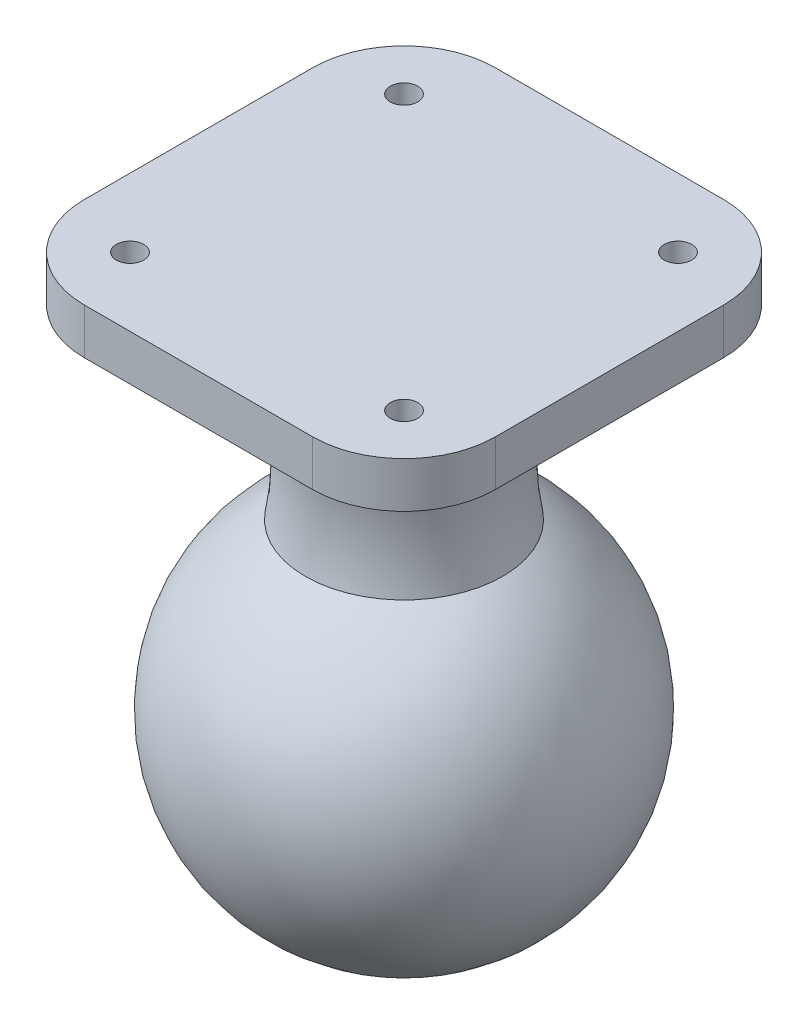
ISO-10303-21;
HEADER;
FILE_DESCRIPTION(('STEP AP214'),'2;1');
FILE_NAME('part.step','',(''),(''),'','','');
FILE_SCHEMA(('AUTOMOTIVE_DESIGN { 1 0 10303 214 1 1 1 1 }'));
ENDSEC;
DATA;
#1=APPLICATION_CONTEXT('core data for automotive mechanical design processes');
#2=APPLICATION_PROTOCOL_DEFINITION('international standard','automotive_design',2000,#1);
#3=PRODUCT_CONTEXT('',#1,'mechanical');
#4=PRODUCT('Part','Part','',(#3));
#5=PRODUCT_RELATED_PRODUCT_CATEGORY('part','',(#4));
#6=PRODUCT_DEFINITION_FORMATION('','',#4);
#7=PRODUCT_DEFINITION_CONTEXT('part definition',#1,'design');
#8=PRODUCT_DEFINITION('design','',#6,#7);
#9=PRODUCT_DEFINITION_SHAPE('','',#8);
#10=(LENGTH_UNIT() NAMED_UNIT(*) SI_UNIT(.MILLI.,.METRE.));
#11=(NAMED_UNIT(*) PLANE_ANGLE_UNIT() SI_UNIT($,.RADIAN.));
#12=(NAMED_UNIT(*) SI_UNIT($,.STERADIAN.) SOLID_ANGLE_UNIT());
#13=UNCERTAINTY_MEASURE_WITH_UNIT(LENGTH_MEASURE(1.E-05),#10,'distance_accuracy_value','');
#14=(GEOMETRIC_REPRESENTATION_CONTEXT(3) GLOBAL_UNCERTAINTY_ASSIGNED_CONTEXT((#13)) GLOBAL_UNIT_ASSIGNED_CONTEXT((#10,
#11,#12)) REPRESENTATION_CONTEXT('',''));
#15=CARTESIAN_POINT('',(0.,0.,0.));
#16=DIRECTION('',(0.,0.,1.));
#17=DIRECTION('',(1.,0.,0.));
#18=AXIS2_PLACEMENT_3D('',#15,#16,#17);
#19=CARTESIAN_POINT('',(0.,-15.,0.));
#20=DIRECTION('',(0.,1.,0.));
#21=DIRECTION('',(0.,0.,1.));
#22=AXIS2_PLACEMENT_3D('',#19,#20,#21);
#23=TOROIDAL_SURFACE('',#22,39.3102194007113,29.);
#24=CARTESIAN_POINT('',(0.,0.,0.));
#25=DIRECTION('',(0.,1.,0.));
#26=DIRECTION('',(0.,0.,1.));
#27=AXIS2_PLACEMENT_3D('',#24,#25,#26);
#28=CIRCLE('',#27,14.4908721087296);
#29=CARTESIAN_POINT('',(0.,0.,14.4908721087296));
#30=VERTEX_POINT('',#29);
#31=EDGE_CURVE('E206',#30,#30,#28,.T.);
#32=ORIENTED_EDGE('',*,*,#31,.F.);
#33=EDGE_LOOP('',(#32));
#34=FACE_BOUND('',#33,.T.);
#35=CARTESIAN_POINT('',(0.,-20.3338313214249,0.));
#36=DIRECTION('',(0.,1.,0.));
#37=DIRECTION('',(0.,0.,1.));
#38=AXIS2_PLACEMENT_3D('',#35,#36,#37);
#39=CIRCLE('',#38,10.8049524587129);
#40=CARTESIAN_POINT('',(0.,-20.3338313214249,10.8049524587129));
#41=VERTEX_POINT('',#40);
#42=EDGE_CURVE('E40',#41,#41,#39,.T.);
#43=ORIENTED_EDGE('',*,*,#42,.T.);
#44=EDGE_LOOP('',(#43));
#45=FACE_BOUND('',#44,.T.);
#46=ADVANCED_FACE('F36',(#34,#45),#23,.F.);
#47=CARTESIAN_POINT('',(12.5,5.,-12.5));
#48=DIRECTION('',(0.,1.,0.));
#49=DIRECTION('',(0.,0.,1.));
#50=AXIS2_PLACEMENT_3D('',#47,#48,#49);
#51=PLANE('',#50);
#52=CARTESIAN_POINT('',(15.,5.,15.));
#53=DIRECTION('',(0.,1.,0.));
#54=DIRECTION('',(0.,0.,1.));
#55=AXIS2_PLACEMENT_3D('',#52,#53,#54);
#56=CIRCLE('',#55,1.5);
#57=CARTESIAN_POINT('',(15.,5.,16.5));
#58=VERTEX_POINT('',#57);
#59=EDGE_CURVE('E194',#58,#58,#56,.T.);
#60=ORIENTED_EDGE('',*,*,#59,.F.);
#61=EDGE_LOOP('',(#60));
#62=FACE_BOUND('',#61,.T.);
#63=CARTESIAN_POINT('',(-15.,5.,-15.));
#64=DIRECTION('',(0.,1.,0.));
#65=DIRECTION('',(0.,0.,1.));
#66=AXIS2_PLACEMENT_3D('',#63,#64,#65);
#67=CIRCLE('',#66,1.5);
#68=CARTESIAN_POINT('',(-15.,5.,-13.5));
#69=VERTEX_POINT('',#68);
#70=EDGE_CURVE('E139',#69,#69,#67,.T.);
#71=ORIENTED_EDGE('',*,*,#70,.F.);
#72=EDGE_LOOP('',(#71));
#73=FACE_BOUND('',#72,.T.);
#74=CARTESIAN_POINT('',(12.5,5.,-12.5));
#75=DIRECTION('',(0.,1.,0.));
#76=DIRECTION('',(0.,0.,1.));
#77=AXIS2_PLACEMENT_3D('',#74,#75,#76);
#78=CIRCLE('',#77,10.);
#79=CARTESIAN_POINT('',(22.5,5.,-12.4999999999999));
#80=VERTEX_POINT('',#79);
#81=CARTESIAN_POINT('',(12.4999999999999,5.,-22.5));
#82=VERTEX_POINT('',#81);
#83=EDGE_CURVE('E150',#80,#82,#78,.T.);
#84=ORIENTED_EDGE('',*,*,#83,.T.);
#85=DIRECTION('',(-1.,0.,0.));
#86=VECTOR('',#85,1.);
#87=CARTESIAN_POINT('',(12.4999999999999,5.,-22.5));
#88=LINE('',#87,#86);
#89=CARTESIAN_POINT('',(-12.4999999999999,5.,-22.5));
#90=VERTEX_POINT('',#89);
#91=EDGE_CURVE('E97',#82,#90,#88,.T.);
#92=ORIENTED_EDGE('',*,*,#91,.T.);
#93=CARTESIAN_POINT('',(-12.5,5.,-12.5));
#94=DIRECTION('',(0.,1.,0.));
#95=DIRECTION('',(0.,0.,1.));
#96=AXIS2_PLACEMENT_3D('',#93,#94,#95);
#97=CIRCLE('',#96,10.);
#98=CARTESIAN_POINT('',(-22.5,5.,-12.4999999999999));
#99=VERTEX_POINT('',#98);
#100=EDGE_CURVE('E166',#90,#99,#97,.T.);
#101=ORIENTED_EDGE('',*,*,#100,.T.);
#102=DIRECTION('',(0.,0.,1.));
#103=VECTOR('',#102,1.);
#104=CARTESIAN_POINT('',(-22.5,5.,12.4999999999999));
#105=LINE('',#104,#103);
#106=CARTESIAN_POINT('',(-22.5,5.,12.4999999999999));
#107=VERTEX_POINT('',#106);
#108=EDGE_CURVE('E179',#99,#107,#105,.T.);
#109=ORIENTED_EDGE('',*,*,#108,.T.);
#110=CARTESIAN_POINT('',(-12.5,5.,12.5));
#111=DIRECTION('',(0.,1.,0.));
#112=DIRECTION('',(0.,0.,-1.));
#113=AXIS2_PLACEMENT_3D('',#110,#111,#112);
#114=CIRCLE('',#113,10.);
#115=CARTESIAN_POINT('',(-12.4999999999999,5.,22.5));
#116=VERTEX_POINT('',#115);
#117=EDGE_CURVE('E117',#107,#116,#114,.T.);
#118=ORIENTED_EDGE('',*,*,#117,.T.);
#119=DIRECTION('',(1.,0.,0.));
#120=VECTOR('',#119,1.);
#121=CARTESIAN_POINT('',(12.4999999999999,5.,22.5));
#122=LINE('',#121,#120);
#123=CARTESIAN_POINT('',(12.4999999999999,5.,22.5));
#124=VERTEX_POINT('',#123);
#125=EDGE_CURVE('E110',#116,#124,#122,.T.);
#126=ORIENTED_EDGE('',*,*,#125,.T.);
#127=CARTESIAN_POINT('',(12.5,5.,12.5));
#128=DIRECTION('',(0.,1.,0.));
#129=DIRECTION('',(0.,0.,1.));
#130=AXIS2_PLACEMENT_3D('',#127,#128,#129);
#131=CIRCLE('',#130,10.);
#132=CARTESIAN_POINT('',(22.5,5.,12.4999999999999));
#133=VERTEX_POINT('',#132);
#134=EDGE_CURVE('E115',#124,#133,#131,.T.);
#135=ORIENTED_EDGE('',*,*,#134,.T.);
#136=DIRECTION('',(0.,0.,-1.));
#137=VECTOR('',#136,1.);
#138=CARTESIAN_POINT('',(22.5,5.,12.4999999999999));
#139=LINE('',#138,#137);
#140=EDGE_CURVE('E54',#133,#80,#139,.T.);
#141=ORIENTED_EDGE('',*,*,#140,.T.);
#142=EDGE_LOOP('',(#84,#92,#101,#109,#118,#126,#135,#141));
#143=FACE_BOUND('',#142,.T.);
#144=CARTESIAN_POINT('',(15.,5.,-15.));
#145=DIRECTION('',(0.,1.,0.));
#146=DIRECTION('',(0.,0.,-1.));
#147=AXIS2_PLACEMENT_3D('',#144,#145,#146);
#148=CIRCLE('',#147,1.5);
#149=CARTESIAN_POINT('',(15.,5.,-16.5));
#150=VERTEX_POINT('',#149);
#151=EDGE_CURVE('E188',#150,#150,#148,.T.);
#152=ORIENTED_EDGE('',*,*,#151,.F.);
#153=EDGE_LOOP('',(#152));
#154=FACE_BOUND('',#153,.T.);
#155=CARTESIAN_POINT('',(-15.,5.,15.));
#156=DIRECTION('',(0.,1.,0.));
#157=DIRECTION('',(0.,0.,-1.));
#158=AXIS2_PLACEMENT_3D('',#155,#156,#157);
#159=CIRCLE('',#158,1.5);
#160=CARTESIAN_POINT('',(-15.,5.,13.5));
#161=VERTEX_POINT('',#160);
#162=EDGE_CURVE('E200',#161,#161,#159,.T.);
#163=ORIENTED_EDGE('',*,*,#162,.F.);
#164=EDGE_LOOP('',(#163));
#165=FACE_BOUND('',#164,.T.);
#166=ADVANCED_FACE('F112',(#62,#73,#143,#154,#165),#51,.T.);
#167=CARTESIAN_POINT('',(12.5,0.,-12.5));
#168=DIRECTION('',(0.,1.,0.));
#169=DIRECTION('',(0.,0.,1.));
#170=AXIS2_PLACEMENT_3D('',#167,#168,#169);
#171=PLANE('',#170);
#172=ORIENTED_EDGE('',*,*,#31,.T.);
#173=EDGE_LOOP('',(#172));
#174=FACE_BOUND('',#173,.T.);
#175=CARTESIAN_POINT('',(12.5,0.,-12.5));
#176=DIRECTION('',(0.,1.,0.));
#177=DIRECTION('',(0.,0.,1.));
#178=AXIS2_PLACEMENT_3D('',#175,#176,#177);
#179=CIRCLE('',#178,10.);
#180=CARTESIAN_POINT('',(22.5,0.,-12.4999999999999));
#181=VERTEX_POINT('',#180);
#182=CARTESIAN_POINT('',(12.4999999999999,0.,-22.5));
#183=VERTEX_POINT('',#182);
#184=EDGE_CURVE('E135',#181,#183,#179,.T.);
#185=ORIENTED_EDGE('',*,*,#184,.F.);
#186=DIRECTION('',(0.,0.,-1.));
#187=VECTOR('',#186,1.);
#188=CARTESIAN_POINT('',(22.5,0.,12.4999999999999));
#189=LINE('',#188,#187);
#190=CARTESIAN_POINT('',(22.5,0.,12.4999999999999));
#191=VERTEX_POINT('',#190);
#192=EDGE_CURVE('E89',#191,#181,#189,.T.);
#193=ORIENTED_EDGE('',*,*,#192,.F.);
#194=CARTESIAN_POINT('',(12.5,0.,12.5));
#195=DIRECTION('',(0.,1.,0.));
#196=DIRECTION('',(0.,0.,1.));
#197=AXIS2_PLACEMENT_3D('',#194,#195,#196);
#198=CIRCLE('',#197,10.);
#199=CARTESIAN_POINT('',(12.4999999999999,0.,22.5));
#200=VERTEX_POINT('',#199);
#201=EDGE_CURVE('E83',#200,#191,#198,.T.);
#202=ORIENTED_EDGE('',*,*,#201,.F.);
#203=DIRECTION('',(1.,0.,0.));
#204=VECTOR('',#203,1.);
#205=CARTESIAN_POINT('',(12.4999999999999,0.,22.5));
#206=LINE('',#205,#204);
#207=CARTESIAN_POINT('',(-12.4999999999999,0.,22.5));
#208=VERTEX_POINT('',#207);
#209=EDGE_CURVE('E125',#208,#200,#206,.T.);
#210=ORIENTED_EDGE('',*,*,#209,.F.);
#211=CARTESIAN_POINT('',(-12.5,0.,12.5));
#212=DIRECTION('',(0.,1.,0.));
#213=DIRECTION('',(0.,0.,-1.));
#214=AXIS2_PLACEMENT_3D('',#211,#212,#213);
#215=CIRCLE('',#214,10.);
#216=CARTESIAN_POINT('',(-22.5,0.,12.4999999999999));
#217=VERTEX_POINT('',#216);
#218=EDGE_CURVE('E145',#217,#208,#215,.T.);
#219=ORIENTED_EDGE('',*,*,#218,.F.);
#220=DIRECTION('',(0.,0.,1.));
#221=VECTOR('',#220,1.);
#222=CARTESIAN_POINT('',(-22.5,0.,12.4999999999999));
#223=LINE('',#222,#221);
#224=CARTESIAN_POINT('',(-22.5,0.,-12.4999999999999));
#225=VERTEX_POINT('',#224);
#226=EDGE_CURVE('E143',#225,#217,#223,.T.);
#227=ORIENTED_EDGE('',*,*,#226,.F.);
#228=CARTESIAN_POINT('',(-12.5,0.,-12.5));
#229=DIRECTION('',(0.,1.,0.));
#230=DIRECTION('',(0.,0.,1.));
#231=AXIS2_PLACEMENT_3D('',#228,#229,#230);
#232=CIRCLE('',#231,10.);
#233=CARTESIAN_POINT('',(-12.4999999999999,0.,-22.5));
#234=VERTEX_POINT('',#233);
#235=EDGE_CURVE('E141',#234,#225,#232,.T.);
#236=ORIENTED_EDGE('',*,*,#235,.F.);
#237=DIRECTION('',(-1.,0.,0.));
#238=VECTOR('',#237,1.);
#239=CARTESIAN_POINT('',(12.4999999999999,0.,-22.5));
#240=LINE('',#239,#238);
#241=EDGE_CURVE('E138',#183,#234,#240,.T.);
#242=ORIENTED_EDGE('',*,*,#241,.F.);
#243=EDGE_LOOP('',(#185,#193,#202,#210,#219,#227,#236,#242));
#244=FACE_BOUND('',#243,.T.);
#245=CARTESIAN_POINT('',(-15.,0.,-15.));
#246=DIRECTION('',(0.,1.,0.));
#247=DIRECTION('',(0.,0.,1.));
#248=AXIS2_PLACEMENT_3D('',#245,#246,#247);
#249=CIRCLE('',#248,1.5);
#250=CARTESIAN_POINT('',(-15.,0.,-13.5));
#251=VERTEX_POINT('',#250);
#252=EDGE_CURVE('E185',#251,#251,#249,.T.);
#253=ORIENTED_EDGE('',*,*,#252,.T.);
#254=EDGE_LOOP('',(#253));
#255=FACE_BOUND('',#254,.T.);
#256=CARTESIAN_POINT('',(15.,0.,-15.));
#257=DIRECTION('',(0.,1.,0.));
#258=DIRECTION('',(0.,0.,-1.));
#259=AXIS2_PLACEMENT_3D('',#256,#257,#258);
#260=CIRCLE('',#259,1.5);
#261=CARTESIAN_POINT('',(15.,0.,-16.5));
#262=VERTEX_POINT('',#261);
#263=EDGE_CURVE('E191',#262,#262,#260,.T.);
#264=ORIENTED_EDGE('',*,*,#263,.T.);
#265=EDGE_LOOP('',(#264));
#266=FACE_BOUND('',#265,.T.);
#267=CARTESIAN_POINT('',(15.,0.,15.));
#268=DIRECTION('',(0.,1.,0.));
#269=DIRECTION('',(0.,0.,1.));
#270=AXIS2_PLACEMENT_3D('',#267,#268,#269);
#271=CIRCLE('',#270,1.5);
#272=CARTESIAN_POINT('',(15.,0.,16.5));
#273=VERTEX_POINT('',#272);
#274=EDGE_CURVE('E197',#273,#273,#271,.T.);
#275=ORIENTED_EDGE('',*,*,#274,.T.);
#276=EDGE_LOOP('',(#275));
#277=FACE_BOUND('',#276,.T.);
#278=CARTESIAN_POINT('',(-15.,0.,15.));
#279=DIRECTION('',(0.,1.,0.));
#280=DIRECTION('',(0.,0.,-1.));
#281=AXIS2_PLACEMENT_3D('',#278,#279,#280);
#282=CIRCLE('',#281,1.5);
#283=CARTESIAN_POINT('',(-15.,0.,13.5));
#284=VERTEX_POINT('',#283);
#285=EDGE_CURVE('E203',#284,#284,#282,.T.);
#286=ORIENTED_EDGE('',*,*,#285,.T.);
#287=EDGE_LOOP('',(#286));
#288=FACE_BOUND('',#287,.T.);
#289=ADVANCED_FACE('F170',(#174,#244,#255,#266,#277,#288),#171,.F.);
#290=CARTESIAN_POINT('',(12.5,5.,-12.5));
#291=DIRECTION('',(0.,-1.,0.));
#292=DIRECTION('',(0.,0.,-1.));
#293=AXIS2_PLACEMENT_3D('',#290,#291,#292);
#294=CYLINDRICAL_SURFACE('',#293,10.);
#295=ORIENTED_EDGE('',*,*,#184,.T.);
#296=DIRECTION('',(0.,-1.,0.));
#297=VECTOR('',#296,1.);
#298=CARTESIAN_POINT('',(12.4999999999999,5.,-22.5));
#299=LINE('',#298,#297);
#300=EDGE_CURVE('E11',#82,#183,#299,.T.);
#301=ORIENTED_EDGE('',*,*,#300,.F.);
#302=ORIENTED_EDGE('',*,*,#83,.F.);
#303=DIRECTION('',(0.,-1.,0.));
#304=VECTOR('',#303,1.);
#305=CARTESIAN_POINT('',(22.5,5.,-12.4999999999999));
#306=LINE('',#305,#304);
#307=EDGE_CURVE('E131',#80,#181,#306,.T.);
#308=ORIENTED_EDGE('',*,*,#307,.T.);
#309=EDGE_LOOP('',(#295,#301,#302,#308));
#310=FACE_BOUND('',#309,.T.);
#311=ADVANCED_FACE('F38',(#310),#294,.T.);
#312=CARTESIAN_POINT('',(12.4999999999999,5.,-22.5));
#313=DIRECTION('',(0.,0.,1.));
#314=DIRECTION('',(1.,0.,0.));
#315=AXIS2_PLACEMENT_3D('',#312,#313,#314);
#316=PLANE('',#315);
#317=ORIENTED_EDGE('',*,*,#241,.T.);
#318=DIRECTION('',(0.,-1.,0.));
#319=VECTOR('',#318,1.);
#320=CARTESIAN_POINT('',(-12.4999999999999,5.,-22.5));
#321=LINE('',#320,#319);
#322=EDGE_CURVE('E46',#90,#234,#321,.T.);
#323=ORIENTED_EDGE('',*,*,#322,.F.);
#324=ORIENTED_EDGE('',*,*,#91,.F.);
#325=ORIENTED_EDGE('',*,*,#300,.T.);
#326=EDGE_LOOP('',(#317,#323,#324,#325));
#327=FACE_BOUND('',#326,.T.);
#328=ADVANCED_FACE('F260',(#327),#316,.F.);
#329=CARTESIAN_POINT('',(-12.5,5.,-12.5));
#330=DIRECTION('',(0.,-1.,0.));
#331=DIRECTION('',(0.,0.,-1.));
#332=AXIS2_PLACEMENT_3D('',#329,#330,#331);
#333=CYLINDRICAL_SURFACE('',#332,10.);
#334=ORIENTED_EDGE('',*,*,#235,.T.);
#335=DIRECTION('',(0.,-1.,0.));
#336=VECTOR('',#335,1.);
#337=CARTESIAN_POINT('',(-22.5,5.,-12.4999999999999));
#338=LINE('',#337,#336);
#339=EDGE_CURVE('E157',#99,#225,#338,.T.);
#340=ORIENTED_EDGE('',*,*,#339,.F.);
#341=ORIENTED_EDGE('',*,*,#100,.F.);
#342=ORIENTED_EDGE('',*,*,#322,.T.);
#343=EDGE_LOOP('',(#334,#340,#341,#342));
#344=FACE_BOUND('',#343,.T.);
#345=ADVANCED_FACE('F164',(#344),#333,.T.);
#346=CARTESIAN_POINT('',(-22.5,5.,12.4999999999999));
#347=DIRECTION('',(1.,0.,0.));
#348=DIRECTION('',(0.,0.,-1.));
#349=AXIS2_PLACEMENT_3D('',#346,#347,#348);
#350=PLANE('',#349);
#351=ORIENTED_EDGE('',*,*,#226,.T.);
#352=DIRECTION('',(0.,-1.,0.));
#353=VECTOR('',#352,1.);
#354=CARTESIAN_POINT('',(-22.5,5.,12.4999999999999));
#355=LINE('',#354,#353);
#356=EDGE_CURVE('E154',#107,#217,#355,.T.);
#357=ORIENTED_EDGE('',*,*,#356,.F.);
#358=ORIENTED_EDGE('',*,*,#108,.F.);
#359=ORIENTED_EDGE('',*,*,#339,.T.);
#360=EDGE_LOOP('',(#351,#357,#358,#359));
#361=FACE_BOUND('',#360,.T.);
#362=ADVANCED_FACE('F175',(#361),#350,.F.);
#363=CARTESIAN_POINT('',(-12.5,5.,12.5));
#364=DIRECTION('',(0.,-1.,0.));
#365=DIRECTION('',(0.,0.,-1.));
#366=AXIS2_PLACEMENT_3D('',#363,#364,#365);
#367=CYLINDRICAL_SURFACE('',#366,10.);
#368=ORIENTED_EDGE('',*,*,#218,.T.);
#369=DIRECTION('',(0.,-1.,0.));
#370=VECTOR('',#369,1.);
#371=CARTESIAN_POINT('',(-12.4999999999999,5.,22.5));
#372=LINE('',#371,#370);
#373=EDGE_CURVE('E126',#116,#208,#372,.T.);
#374=ORIENTED_EDGE('',*,*,#373,.F.);
#375=ORIENTED_EDGE('',*,*,#117,.F.);
#376=ORIENTED_EDGE('',*,*,#356,.T.);
#377=EDGE_LOOP('',(#368,#374,#375,#376));
#378=FACE_BOUND('',#377,.T.);
#379=ADVANCED_FACE('F178',(#378),#367,.T.);
#380=CARTESIAN_POINT('',(12.4999999999999,5.,22.5));
#381=DIRECTION('',(0.,0.,-1.));
#382=DIRECTION('',(-1.,0.,0.));
#383=AXIS2_PLACEMENT_3D('',#380,#381,#382);
#384=PLANE('',#383);
#385=ORIENTED_EDGE('',*,*,#209,.T.);
#386=DIRECTION('',(0.,-1.,0.));
#387=VECTOR('',#386,1.);
#388=CARTESIAN_POINT('',(12.4999999999999,5.,22.5));
#389=LINE('',#388,#387);
#390=EDGE_CURVE('E122',#124,#200,#389,.T.);
#391=ORIENTED_EDGE('',*,*,#390,.F.);
#392=ORIENTED_EDGE('',*,*,#125,.F.);
#393=ORIENTED_EDGE('',*,*,#373,.T.);
#394=EDGE_LOOP('',(#385,#391,#392,#393));
#395=FACE_BOUND('',#394,.T.);
#396=ADVANCED_FACE('F123',(#395),#384,.F.);
#397=CARTESIAN_POINT('',(12.5,5.,12.5));
#398=DIRECTION('',(0.,-1.,0.));
#399=DIRECTION('',(0.,0.,-1.));
#400=AXIS2_PLACEMENT_3D('',#397,#398,#399);
#401=CYLINDRICAL_SURFACE('',#400,10.);
#402=ORIENTED_EDGE('',*,*,#201,.T.);
#403=DIRECTION('',(0.,-1.,0.));
#404=VECTOR('',#403,1.);
#405=CARTESIAN_POINT('',(22.5,5.,12.4999999999999));
#406=LINE('',#405,#404);
#407=EDGE_CURVE('E127',#133,#191,#406,.T.);
#408=ORIENTED_EDGE('',*,*,#407,.F.);
#409=ORIENTED_EDGE('',*,*,#134,.F.);
#410=ORIENTED_EDGE('',*,*,#390,.T.);
#411=EDGE_LOOP('',(#402,#408,#409,#410));
#412=FACE_BOUND('',#411,.T.);
#413=ADVANCED_FACE('F129',(#412),#401,.T.);
#414=CARTESIAN_POINT('',(22.5,5.,12.4999999999999));
#415=DIRECTION('',(-1.,0.,0.));
#416=DIRECTION('',(0.,0.,1.));
#417=AXIS2_PLACEMENT_3D('',#414,#415,#416);
#418=PLANE('',#417);
#419=ORIENTED_EDGE('',*,*,#192,.T.);
#420=ORIENTED_EDGE('',*,*,#307,.F.);
#421=ORIENTED_EDGE('',*,*,#140,.F.);
#422=ORIENTED_EDGE('',*,*,#407,.T.);
#423=EDGE_LOOP('',(#419,#420,#421,#422));
#424=FACE_BOUND('',#423,.T.);
#425=ADVANCED_FACE('F244',(#424),#418,.F.);
#426=CARTESIAN_POINT('',(-15.,5.,-15.));
#427=DIRECTION('',(0.,-1.,0.));
#428=DIRECTION('',(0.,0.,-1.));
#429=AXIS2_PLACEMENT_3D('',#426,#427,#428);
#430=CYLINDRICAL_SURFACE('',#429,1.5);
#431=ORIENTED_EDGE('',*,*,#70,.T.);
#432=EDGE_LOOP('',(#431));
#433=FACE_BOUND('',#432,.T.);
#434=ORIENTED_EDGE('',*,*,#252,.F.);
#435=EDGE_LOOP('',(#434));
#436=FACE_BOUND('',#435,.T.);
#437=ADVANCED_FACE('F241',(#433,#436),#430,.F.);
#438=CARTESIAN_POINT('',(15.,5.,-15.));
#439=DIRECTION('',(0.,-1.,0.));
#440=DIRECTION('',(0.,0.,-1.));
#441=AXIS2_PLACEMENT_3D('',#438,#439,#440);
#442=CYLINDRICAL_SURFACE('',#441,1.5);
#443=ORIENTED_EDGE('',*,*,#151,.T.);
#444=EDGE_LOOP('',(#443));
#445=FACE_BOUND('',#444,.T.);
#446=ORIENTED_EDGE('',*,*,#263,.F.);
#447=EDGE_LOOP('',(#446));
#448=FACE_BOUND('',#447,.T.);
#449=ADVANCED_FACE('F237',(#445,#448),#442,.F.);
#450=CARTESIAN_POINT('',(15.,5.,15.));
#451=DIRECTION('',(0.,-1.,0.));
#452=DIRECTION('',(0.,0.,-1.));
#453=AXIS2_PLACEMENT_3D('',#450,#451,#452);
#454=CYLINDRICAL_SURFACE('',#453,1.5);
#455=ORIENTED_EDGE('',*,*,#59,.T.);
#456=EDGE_LOOP('',(#455));
#457=FACE_BOUND('',#456,.T.);
#458=ORIENTED_EDGE('',*,*,#274,.F.);
#459=EDGE_LOOP('',(#458));
#460=FACE_BOUND('',#459,.T.);
#461=ADVANCED_FACE('F223',(#457,#460),#454,.F.);
#462=CARTESIAN_POINT('',(-15.,5.,15.));
#463=DIRECTION('',(0.,-1.,0.));
#464=DIRECTION('',(0.,0.,-1.));
#465=AXIS2_PLACEMENT_3D('',#462,#463,#464);
#466=CYLINDRICAL_SURFACE('',#465,1.5);
#467=ORIENTED_EDGE('',*,*,#162,.T.);
#468=EDGE_LOOP('',(#467));
#469=FACE_BOUND('',#468,.T.);
#470=ORIENTED_EDGE('',*,*,#285,.F.);
#471=EDGE_LOOP('',(#470));
#472=FACE_BOUND('',#471,.T.);
#473=ADVANCED_FACE('F218',(#469,#472),#466,.F.);
#474=CARTESIAN_POINT('',(0.,-38.2214630454956,0.));
#475=DIRECTION('',(0.,-1.,0.));
#476=DIRECTION('',(0.,0.,1.));
#477=AXIS2_PLACEMENT_3D('',#474,#475,#476);
#478=SPHERICAL_SURFACE('',#477,20.8977119879432);
#479=ORIENTED_EDGE('',*,*,#42,.F.);
#480=EDGE_LOOP('',(#479));
#481=FACE_BOUND('',#480,.T.);
#482=ADVANCED_FACE('F216',(#481),#478,.T.);
#483=CLOSED_SHELL('',(#46,#166,#289,#311,#328,#345,#362,#379,#396,#413,#425,#437,#449,#461,#473,#482));
#484=MANIFOLD_SOLID_BREP('B2',#483);
#485=ADVANCED_BREP_SHAPE_REPRESENTATION('',(#18,#484),#14);
#486=SHAPE_DEFINITION_REPRESENTATION(#9,#485);
ENDSEC;
END-ISO-10303-21;
